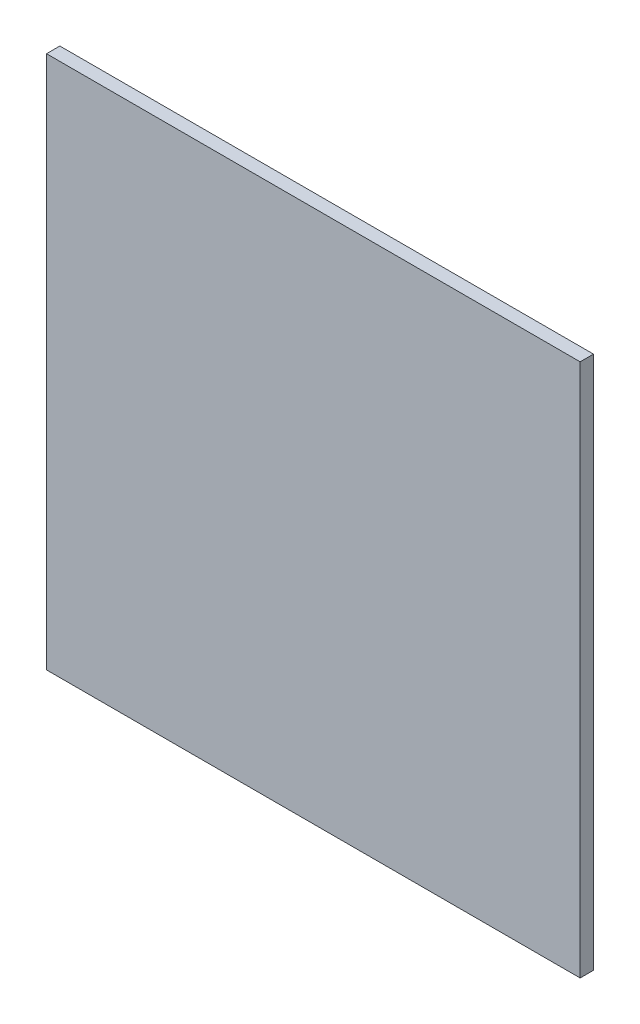
ISO-10303-21;
HEADER;
FILE_DESCRIPTION(('STEP AP214'),'2;1');
FILE_NAME('part.step','',(''),(''),'','','');
FILE_SCHEMA(('AUTOMOTIVE_DESIGN { 1 0 10303 214 1 1 1 1 }'));
ENDSEC;
DATA;
#1=APPLICATION_CONTEXT('core data for automotive mechanical design processes');
#2=APPLICATION_PROTOCOL_DEFINITION('international standard','automotive_design',2000,#1);
#3=PRODUCT_CONTEXT('',#1,'mechanical');
#4=PRODUCT('Part','Part','',(#3));
#5=PRODUCT_RELATED_PRODUCT_CATEGORY('part','',(#4));
#6=PRODUCT_DEFINITION_FORMATION('','',#4);
#7=PRODUCT_DEFINITION_CONTEXT('part definition',#1,'design');
#8=PRODUCT_DEFINITION('design','',#6,#7);
#9=PRODUCT_DEFINITION_SHAPE('','',#8);
#10=(LENGTH_UNIT() NAMED_UNIT(*) SI_UNIT(.MILLI.,.METRE.));
#11=(NAMED_UNIT(*) PLANE_ANGLE_UNIT() SI_UNIT($,.RADIAN.));
#12=(NAMED_UNIT(*) SI_UNIT($,.STERADIAN.) SOLID_ANGLE_UNIT());
#13=UNCERTAINTY_MEASURE_WITH_UNIT(LENGTH_MEASURE(1.E-05),#10,'distance_accuracy_value','');
#14=(GEOMETRIC_REPRESENTATION_CONTEXT(3) GLOBAL_UNCERTAINTY_ASSIGNED_CONTEXT((#13)) GLOBAL_UNIT_ASSIGNED_CONTEXT((#10,
#11,#12)) REPRESENTATION_CONTEXT('',''));
#15=CARTESIAN_POINT('',(0.,0.,0.));
#16=DIRECTION('',(0.,0.,1.));
#17=DIRECTION('',(1.,0.,0.));
#18=AXIS2_PLACEMENT_3D('',#15,#16,#17);
#19=CARTESIAN_POINT('',(-60.,60.,3.));
#20=DIRECTION('',(1.,0.,0.));
#21=DIRECTION('',(0.,1.,0.));
#22=AXIS2_PLACEMENT_3D('',#19,#20,#21);
#23=PLANE('',#22);
#24=DIRECTION('',(0.,-1.,0.));
#25=VECTOR('',#24,1.);
#26=CARTESIAN_POINT('',(-60.,60.,0.));
#27=LINE('',#26,#25);
#28=CARTESIAN_POINT('',(-60.,60.,0.));
#29=VERTEX_POINT('',#28);
#30=CARTESIAN_POINT('',(-60.,-60.,0.));
#31=VERTEX_POINT('',#30);
#32=EDGE_CURVE('E113',#29,#31,#27,.T.);
#33=ORIENTED_EDGE('',*,*,#32,.T.);
#34=DIRECTION('',(0.,0.,-1.));
#35=VECTOR('',#34,1.);
#36=CARTESIAN_POINT('',(-60.,-60.,3.));
#37=LINE('',#36,#35);
#38=CARTESIAN_POINT('',(-60.,-60.,3.));
#39=VERTEX_POINT('',#38);
#40=EDGE_CURVE('E11',#39,#31,#37,.T.);
#41=ORIENTED_EDGE('',*,*,#40,.F.);
#42=DIRECTION('',(0.,-1.,0.));
#43=VECTOR('',#42,1.);
#44=CARTESIAN_POINT('',(-60.,60.,3.));
#45=LINE('',#44,#43);
#46=CARTESIAN_POINT('',(-60.,60.,3.));
#47=VERTEX_POINT('',#46);
#48=EDGE_CURVE('E97',#47,#39,#45,.T.);
#49=ORIENTED_EDGE('',*,*,#48,.F.);
#50=DIRECTION('',(0.,0.,-1.));
#51=VECTOR('',#50,1.);
#52=CARTESIAN_POINT('',(-60.,60.,3.));
#53=LINE('',#52,#51);
#54=EDGE_CURVE('E109',#47,#29,#53,.T.);
#55=ORIENTED_EDGE('',*,*,#54,.T.);
#56=EDGE_LOOP('',(#33,#41,#49,#55));
#57=FACE_BOUND('',#56,.T.);
#58=ADVANCED_FACE('F45',(#57),#23,.F.);
#59=CARTESIAN_POINT('',(-60.,-60.,3.));
#60=DIRECTION('',(0.,1.,0.));
#61=DIRECTION('',(0.,0.,1.));
#62=AXIS2_PLACEMENT_3D('',#59,#60,#61);
#63=PLANE('',#62);
#64=DIRECTION('',(1.,0.,0.));
#65=VECTOR('',#64,1.);
#66=CARTESIAN_POINT('',(-60.,-60.,0.));
#67=LINE('',#66,#65);
#68=CARTESIAN_POINT('',(60.,-60.,0.));
#69=VERTEX_POINT('',#68);
#70=EDGE_CURVE('E102',#31,#69,#67,.T.);
#71=ORIENTED_EDGE('',*,*,#70,.T.);
#72=DIRECTION('',(0.,0.,-1.));
#73=VECTOR('',#72,1.);
#74=CARTESIAN_POINT('',(60.,-60.,3.));
#75=LINE('',#74,#73);
#76=CARTESIAN_POINT('',(60.,-60.,3.));
#77=VERTEX_POINT('',#76);
#78=EDGE_CURVE('E54',#77,#69,#75,.T.);
#79=ORIENTED_EDGE('',*,*,#78,.F.);
#80=DIRECTION('',(1.,0.,0.));
#81=VECTOR('',#80,1.);
#82=CARTESIAN_POINT('',(-60.,-60.,3.));
#83=LINE('',#82,#81);
#84=EDGE_CURVE('E92',#39,#77,#83,.T.);
#85=ORIENTED_EDGE('',*,*,#84,.F.);
#86=ORIENTED_EDGE('',*,*,#40,.T.);
#87=EDGE_LOOP('',(#71,#79,#85,#86));
#88=FACE_BOUND('',#87,.T.);
#89=ADVANCED_FACE('F101',(#88),#63,.F.);
#90=CARTESIAN_POINT('',(60.,60.,3.));
#91=DIRECTION('',(-1.,0.,0.));
#92=DIRECTION('',(0.,-1.,0.));
#93=AXIS2_PLACEMENT_3D('',#90,#91,#92);
#94=PLANE('',#93);
#95=DIRECTION('',(0.,1.,0.));
#96=VECTOR('',#95,1.);
#97=CARTESIAN_POINT('',(60.,60.,0.));
#98=LINE('',#97,#96);
#99=CARTESIAN_POINT('',(60.,60.,0.));
#100=VERTEX_POINT('',#99);
#101=EDGE_CURVE('E79',#69,#100,#98,.T.);
#102=ORIENTED_EDGE('',*,*,#101,.T.);
#103=DIRECTION('',(0.,0.,-1.));
#104=VECTOR('',#103,1.);
#105=CARTESIAN_POINT('',(60.,60.,3.));
#106=LINE('',#105,#104);
#107=CARTESIAN_POINT('',(60.,60.,3.));
#108=VERTEX_POINT('',#107);
#109=EDGE_CURVE('E104',#108,#100,#106,.T.);
#110=ORIENTED_EDGE('',*,*,#109,.F.);
#111=DIRECTION('',(0.,1.,0.));
#112=VECTOR('',#111,1.);
#113=CARTESIAN_POINT('',(60.,60.,3.));
#114=LINE('',#113,#112);
#115=EDGE_CURVE('E95',#77,#108,#114,.T.);
#116=ORIENTED_EDGE('',*,*,#115,.F.);
#117=ORIENTED_EDGE('',*,*,#78,.T.);
#118=EDGE_LOOP('',(#102,#110,#116,#117));
#119=FACE_BOUND('',#118,.T.);
#120=ADVANCED_FACE('F105',(#119),#94,.F.);
#121=CARTESIAN_POINT('',(-60.,60.,3.));
#122=DIRECTION('',(0.,-1.,0.));
#123=DIRECTION('',(0.,0.,-1.));
#124=AXIS2_PLACEMENT_3D('',#121,#122,#123);
#125=PLANE('',#124);
#126=DIRECTION('',(-1.,0.,0.));
#127=VECTOR('',#126,1.);
#128=CARTESIAN_POINT('',(-60.,60.,0.));
#129=LINE('',#128,#127);
#130=EDGE_CURVE('E85',#100,#29,#129,.T.);
#131=ORIENTED_EDGE('',*,*,#130,.T.);
#132=ORIENTED_EDGE('',*,*,#54,.F.);
#133=DIRECTION('',(-1.,0.,0.));
#134=VECTOR('',#133,1.);
#135=CARTESIAN_POINT('',(-60.,60.,3.));
#136=LINE('',#135,#134);
#137=EDGE_CURVE('E62',#108,#47,#136,.T.);
#138=ORIENTED_EDGE('',*,*,#137,.F.);
#139=ORIENTED_EDGE('',*,*,#109,.T.);
#140=EDGE_LOOP('',(#131,#132,#138,#139));
#141=FACE_BOUND('',#140,.T.);
#142=ADVANCED_FACE('F126',(#141),#125,.F.);
#143=CARTESIAN_POINT('',(0.,0.,3.));
#144=DIRECTION('',(0.,0.,1.));
#145=DIRECTION('',(1.,0.,0.));
#146=AXIS2_PLACEMENT_3D('',#143,#144,#145);
#147=PLANE('',#146);
#148=ORIENTED_EDGE('',*,*,#48,.T.);
#149=ORIENTED_EDGE('',*,*,#84,.T.);
#150=ORIENTED_EDGE('',*,*,#115,.T.);
#151=ORIENTED_EDGE('',*,*,#137,.T.);
#152=EDGE_LOOP('',(#148,#149,#150,#151));
#153=FACE_BOUND('',#152,.T.);
#154=ADVANCED_FACE('F93',(#153),#147,.T.);
#155=CARTESIAN_POINT('',(0.,0.,0.));
#156=DIRECTION('',(0.,0.,1.));
#157=DIRECTION('',(1.,0.,0.));
#158=AXIS2_PLACEMENT_3D('',#155,#156,#157);
#159=PLANE('',#158);
#160=ORIENTED_EDGE('',*,*,#32,.F.);
#161=ORIENTED_EDGE('',*,*,#130,.F.);
#162=ORIENTED_EDGE('',*,*,#101,.F.);
#163=ORIENTED_EDGE('',*,*,#70,.F.);
#164=EDGE_LOOP('',(#160,#161,#162,#163));
#165=FACE_BOUND('',#164,.T.);
#166=ADVANCED_FACE('F129',(#165),#159,.F.);
#167=CLOSED_SHELL('',(#58,#89,#120,#142,#154,#166));
#168=MANIFOLD_SOLID_BREP('B2',#167);
#169=ADVANCED_BREP_SHAPE_REPRESENTATION('',(#18,#168),#14);
#170=SHAPE_DEFINITION_REPRESENTATION(#9,#169);
ENDSEC;
END-ISO-10303-21;
